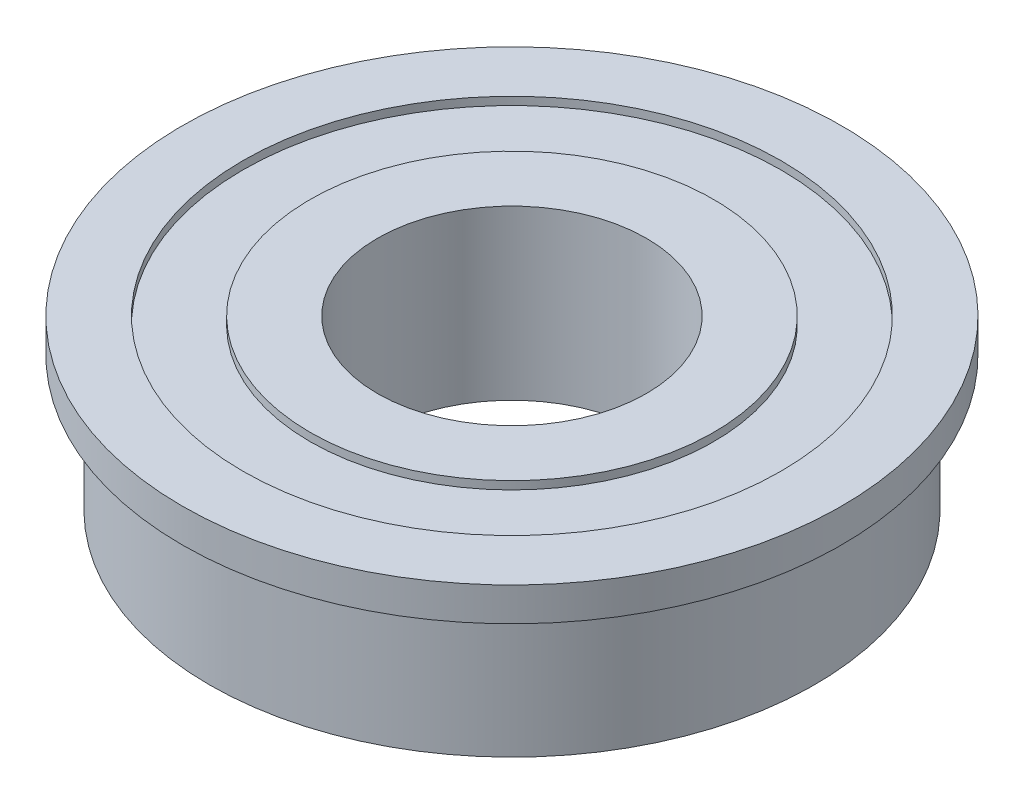
ISO-10303-21;
HEADER;
FILE_DESCRIPTION(('STEP AP214'),'2;1');
FILE_NAME('part.step','',(''),(''),'','','');
FILE_SCHEMA(('AUTOMOTIVE_DESIGN { 1 0 10303 214 1 1 1 1 }'));
ENDSEC;
DATA;
#1=APPLICATION_CONTEXT('core data for automotive mechanical design processes');
#2=APPLICATION_PROTOCOL_DEFINITION('international standard','automotive_design',2000,#1);
#3=PRODUCT_CONTEXT('',#1,'mechanical');
#4=PRODUCT('Part','Part','',(#3));
#5=PRODUCT_RELATED_PRODUCT_CATEGORY('part','',(#4));
#6=PRODUCT_DEFINITION_FORMATION('','',#4);
#7=PRODUCT_DEFINITION_CONTEXT('part definition',#1,'design');
#8=PRODUCT_DEFINITION('design','',#6,#7);
#9=PRODUCT_DEFINITION_SHAPE('','',#8);
#10=(LENGTH_UNIT() NAMED_UNIT(*) SI_UNIT(.MILLI.,.METRE.));
#11=(NAMED_UNIT(*) PLANE_ANGLE_UNIT() SI_UNIT($,.RADIAN.));
#12=(NAMED_UNIT(*) SI_UNIT($,.STERADIAN.) SOLID_ANGLE_UNIT());
#13=UNCERTAINTY_MEASURE_WITH_UNIT(LENGTH_MEASURE(1.E-05),#10,'distance_accuracy_value','');
#14=(GEOMETRIC_REPRESENTATION_CONTEXT(3) GLOBAL_UNCERTAINTY_ASSIGNED_CONTEXT((#13)) GLOBAL_UNIT_ASSIGNED_CONTEXT((#10,
#11,#12)) REPRESENTATION_CONTEXT('',''));
#15=CARTESIAN_POINT('',(0.,0.,0.));
#16=DIRECTION('',(0.,0.,1.));
#17=DIRECTION('',(1.,0.,0.));
#18=AXIS2_PLACEMENT_3D('',#15,#16,#17);
#19=CARTESIAN_POINT('',(14.2875,0.,0.));
#20=DIRECTION('',(0.,-1.,0.));
#21=DIRECTION('',(0.,0.,-1.));
#22=AXIS2_PLACEMENT_3D('',#19,#20,#21);
#23=PLANE('',#22);
#24=CARTESIAN_POINT('',(0.,0.,0.));
#25=DIRECTION('',(0.,1.,0.));
#26=DIRECTION('',(0.,0.,1.));
#27=AXIS2_PLACEMENT_3D('',#24,#25,#26);
#28=CIRCLE('',#27,6.35);
#29=CARTESIAN_POINT('',(0.,0.,6.35));
#30=VERTEX_POINT('',#29);
#31=EDGE_CURVE('E42',#30,#30,#28,.T.);
#32=ORIENTED_EDGE('',*,*,#31,.T.);
#33=EDGE_LOOP('',(#32));
#34=FACE_BOUND('',#33,.T.);
#35=CARTESIAN_POINT('',(0.,0.,0.));
#36=DIRECTION('',(0.,-1.,0.));
#37=DIRECTION('',(0.,0.,-1.));
#38=AXIS2_PLACEMENT_3D('',#35,#36,#37);
#39=CIRCLE('',#38,9.525);
#40=CARTESIAN_POINT('',(0.,0.,-9.525));
#41=VERTEX_POINT('',#40);
#42=EDGE_CURVE('E83',#41,#41,#39,.T.);
#43=ORIENTED_EDGE('',*,*,#42,.T.);
#44=EDGE_LOOP('',(#43));
#45=FACE_BOUND('',#44,.T.);
#46=ADVANCED_FACE('F34',(#34,#45),#23,.T.);
#47=CARTESIAN_POINT('',(0.,0.,0.));
#48=DIRECTION('',(0.,1.,0.));
#49=DIRECTION('',(0.,0.,1.));
#50=AXIS2_PLACEMENT_3D('',#47,#48,#49);
#51=CYLINDRICAL_SURFACE('',#50,12.7);
#52=CARTESIAN_POINT('',(0.,7.9375,0.));
#53=DIRECTION('',(0.,1.,0.));
#54=DIRECTION('',(0.,0.,1.));
#55=AXIS2_PLACEMENT_3D('',#52,#53,#54);
#56=CIRCLE('',#55,12.7);
#57=CARTESIAN_POINT('',(0.,7.9375,12.7));
#58=VERTEX_POINT('',#57);
#59=EDGE_CURVE('E69',#58,#58,#56,.F.);
#60=ORIENTED_EDGE('',*,*,#59,.F.);
#61=EDGE_LOOP('',(#60));
#62=FACE_BOUND('',#61,.T.);
#63=CARTESIAN_POINT('',(0.,7.5565,0.));
#64=DIRECTION('',(0.,1.,0.));
#65=DIRECTION('',(0.,0.,1.));
#66=AXIS2_PLACEMENT_3D('',#63,#64,#65);
#67=CIRCLE('',#66,12.7);
#68=CARTESIAN_POINT('',(0.,7.5565,12.7));
#69=VERTEX_POINT('',#68);
#70=EDGE_CURVE('E38',#69,#69,#67,.T.);
#71=ORIENTED_EDGE('',*,*,#70,.F.);
#72=EDGE_LOOP('',(#71));
#73=FACE_BOUND('',#72,.T.);
#74=ADVANCED_FACE('F36',(#62,#73),#51,.F.);
#75=CARTESIAN_POINT('',(9.525,7.5565,0.));
#76=DIRECTION('',(0.,1.,0.));
#77=DIRECTION('',(0.,0.,1.));
#78=AXIS2_PLACEMENT_3D('',#75,#76,#77);
#79=PLANE('',#78);
#80=CARTESIAN_POINT('',(0.,7.5565,0.));
#81=DIRECTION('',(0.,1.,0.));
#82=DIRECTION('',(0.,0.,1.));
#83=AXIS2_PLACEMENT_3D('',#80,#81,#82);
#84=CIRCLE('',#83,9.525);
#85=CARTESIAN_POINT('',(0.,7.5565,9.525));
#86=VERTEX_POINT('',#85);
#87=EDGE_CURVE('E67',#86,#86,#84,.T.);
#88=ORIENTED_EDGE('',*,*,#87,.F.);
#89=EDGE_LOOP('',(#88));
#90=FACE_BOUND('',#89,.T.);
#91=ORIENTED_EDGE('',*,*,#70,.T.);
#92=EDGE_LOOP('',(#91));
#93=FACE_BOUND('',#92,.T.);
#94=ADVANCED_FACE('F110',(#90,#93),#79,.T.);
#95=CARTESIAN_POINT('',(12.7,7.9375,0.));
#96=DIRECTION('',(0.,1.,0.));
#97=DIRECTION('',(0.,0.,1.));
#98=AXIS2_PLACEMENT_3D('',#95,#96,#97);
#99=PLANE('',#98);
#100=ORIENTED_EDGE('',*,*,#59,.T.);
#101=EDGE_LOOP('',(#100));
#102=FACE_BOUND('',#101,.T.);
#103=CARTESIAN_POINT('',(0.,7.9375,0.));
#104=DIRECTION('',(0.,1.,0.));
#105=DIRECTION('',(0.,0.,1.));
#106=AXIS2_PLACEMENT_3D('',#103,#104,#105);
#107=CIRCLE('',#106,15.5575);
#108=CARTESIAN_POINT('',(0.,7.9375,15.5575));
#109=VERTEX_POINT('',#108);
#110=EDGE_CURVE('E64',#109,#109,#107,.F.);
#111=ORIENTED_EDGE('',*,*,#110,.F.);
#112=EDGE_LOOP('',(#111));
#113=FACE_BOUND('',#112,.T.);
#114=ADVANCED_FACE('F146',(#102,#113),#99,.T.);
#115=CARTESIAN_POINT('',(0.,0.,0.));
#116=DIRECTION('',(0.,1.,0.));
#117=DIRECTION('',(0.,0.,1.));
#118=AXIS2_PLACEMENT_3D('',#115,#116,#117);
#119=CYLINDRICAL_SURFACE('',#118,9.525);
#120=ORIENTED_EDGE('',*,*,#87,.T.);
#121=EDGE_LOOP('',(#120));
#122=FACE_BOUND('',#121,.T.);
#123=CARTESIAN_POINT('',(0.,7.9375,0.));
#124=DIRECTION('',(0.,1.,0.));
#125=DIRECTION('',(0.,0.,1.));
#126=AXIS2_PLACEMENT_3D('',#123,#124,#125);
#127=CIRCLE('',#126,9.525);
#128=CARTESIAN_POINT('',(0.,7.9375,9.525));
#129=VERTEX_POINT('',#128);
#130=EDGE_CURVE('E61',#129,#129,#127,.T.);
#131=ORIENTED_EDGE('',*,*,#130,.F.);
#132=EDGE_LOOP('',(#131));
#133=FACE_BOUND('',#132,.T.);
#134=ADVANCED_FACE('F142',(#122,#133),#119,.T.);
#135=CARTESIAN_POINT('',(0.,0.,0.));
#136=DIRECTION('',(0.,1.,0.));
#137=DIRECTION('',(0.,0.,1.));
#138=AXIS2_PLACEMENT_3D('',#135,#136,#137);
#139=CYLINDRICAL_SURFACE('',#138,15.5575);
#140=CARTESIAN_POINT('',(0.,6.35,0.));
#141=DIRECTION('',(0.,1.,0.));
#142=DIRECTION('',(0.,0.,1.));
#143=AXIS2_PLACEMENT_3D('',#140,#141,#142);
#144=CIRCLE('',#143,15.5575);
#145=CARTESIAN_POINT('',(0.,6.35,15.5575));
#146=VERTEX_POINT('',#145);
#147=EDGE_CURVE('E58',#146,#146,#144,.F.);
#148=ORIENTED_EDGE('',*,*,#147,.F.);
#149=EDGE_LOOP('',(#148));
#150=FACE_BOUND('',#149,.T.);
#151=ORIENTED_EDGE('',*,*,#110,.T.);
#152=EDGE_LOOP('',(#151));
#153=FACE_BOUND('',#152,.T.);
#154=ADVANCED_FACE('F138',(#150,#153),#139,.T.);
#155=CARTESIAN_POINT('',(6.35,7.9375,0.));
#156=DIRECTION('',(0.,1.,0.));
#157=DIRECTION('',(0.,0.,1.));
#158=AXIS2_PLACEMENT_3D('',#155,#156,#157);
#159=PLANE('',#158);
#160=CARTESIAN_POINT('',(0.,7.9375,0.));
#161=DIRECTION('',(0.,1.,0.));
#162=DIRECTION('',(0.,0.,1.));
#163=AXIS2_PLACEMENT_3D('',#160,#161,#162);
#164=CIRCLE('',#163,6.35);
#165=CARTESIAN_POINT('',(0.,7.9375,6.35));
#166=VERTEX_POINT('',#165);
#167=EDGE_CURVE('E55',#166,#166,#164,.F.);
#168=ORIENTED_EDGE('',*,*,#167,.T.);
#169=EDGE_LOOP('',(#168));
#170=FACE_BOUND('',#169,.T.);
#171=ORIENTED_EDGE('',*,*,#130,.T.);
#172=EDGE_LOOP('',(#171));
#173=FACE_BOUND('',#172,.T.);
#174=ADVANCED_FACE('F134',(#170,#173),#159,.T.);
#175=CARTESIAN_POINT('',(15.5575,6.35,0.));
#176=DIRECTION('',(0.,-1.,0.));
#177=DIRECTION('',(0.,0.,-1.));
#178=AXIS2_PLACEMENT_3D('',#175,#176,#177);
#179=PLANE('',#178);
#180=ORIENTED_EDGE('',*,*,#147,.T.);
#181=EDGE_LOOP('',(#180));
#182=FACE_BOUND('',#181,.T.);
#183=CARTESIAN_POINT('',(0.,6.35,0.));
#184=DIRECTION('',(0.,1.,0.));
#185=DIRECTION('',(0.,0.,1.));
#186=AXIS2_PLACEMENT_3D('',#183,#184,#185);
#187=CIRCLE('',#186,14.2875);
#188=CARTESIAN_POINT('',(0.,6.35,14.2875));
#189=VERTEX_POINT('',#188);
#190=EDGE_CURVE('E47',#189,#189,#187,.F.);
#191=ORIENTED_EDGE('',*,*,#190,.F.);
#192=EDGE_LOOP('',(#191));
#193=FACE_BOUND('',#192,.T.);
#194=ADVANCED_FACE('F127',(#182,#193),#179,.T.);
#195=CARTESIAN_POINT('',(0.,0.,0.));
#196=DIRECTION('',(0.,1.,0.));
#197=DIRECTION('',(0.,0.,1.));
#198=AXIS2_PLACEMENT_3D('',#195,#196,#197);
#199=CYLINDRICAL_SURFACE('',#198,6.35);
#200=ORIENTED_EDGE('',*,*,#167,.F.);
#201=EDGE_LOOP('',(#200));
#202=FACE_BOUND('',#201,.T.);
#203=ORIENTED_EDGE('',*,*,#31,.F.);
#204=EDGE_LOOP('',(#203));
#205=FACE_BOUND('',#204,.T.);
#206=ADVANCED_FACE('F120',(#202,#205),#199,.F.);
#207=CARTESIAN_POINT('',(0.,0.,0.));
#208=DIRECTION('',(0.,1.,0.));
#209=DIRECTION('',(0.,0.,1.));
#210=AXIS2_PLACEMENT_3D('',#207,#208,#209);
#211=CYLINDRICAL_SURFACE('',#210,14.2875);
#212=CARTESIAN_POINT('',(0.,0.,0.));
#213=DIRECTION('',(0.,1.,0.));
#214=DIRECTION('',(0.,0.,1.));
#215=AXIS2_PLACEMENT_3D('',#212,#213,#214);
#216=CIRCLE('',#215,14.2875);
#217=CARTESIAN_POINT('',(0.,0.,14.2875));
#218=VERTEX_POINT('',#217);
#219=EDGE_CURVE('E10',#218,#218,#216,.F.);
#220=ORIENTED_EDGE('',*,*,#219,.F.);
#221=EDGE_LOOP('',(#220));
#222=FACE_BOUND('',#221,.T.);
#223=ORIENTED_EDGE('',*,*,#190,.T.);
#224=EDGE_LOOP('',(#223));
#225=FACE_BOUND('',#224,.T.);
#226=ADVANCED_FACE('F115',(#222,#225),#211,.T.);
#227=CARTESIAN_POINT('',(0.,0.,0.));
#228=DIRECTION('',(0.,-1.,0.));
#229=DIRECTION('',(0.,0.,-1.));
#230=AXIS2_PLACEMENT_3D('',#227,#228,#229);
#231=CIRCLE('',#230,12.7);
#232=CARTESIAN_POINT('',(0.,0.,-12.7));
#233=VERTEX_POINT('',#232);
#234=EDGE_CURVE('E50',#233,#233,#231,.T.);
#235=ORIENTED_EDGE('',*,*,#234,.F.);
#236=EDGE_LOOP('',(#235));
#237=FACE_BOUND('',#236,.T.);
#238=ORIENTED_EDGE('',*,*,#219,.T.);
#239=EDGE_LOOP('',(#238));
#240=FACE_BOUND('',#239,.T.);
#241=ADVANCED_FACE('F101',(#237,#240),#23,.T.);
#242=CARTESIAN_POINT('',(0.,1.27,0.));
#243=DIRECTION('',(0.,-1.,0.));
#244=DIRECTION('',(0.,0.,-1.));
#245=AXIS2_PLACEMENT_3D('',#242,#243,#244);
#246=CYLINDRICAL_SURFACE('',#245,12.7);
#247=CARTESIAN_POINT('',(0.,1.27,0.));
#248=DIRECTION('',(0.,-1.,0.));
#249=DIRECTION('',(0.,0.,-1.));
#250=AXIS2_PLACEMENT_3D('',#247,#248,#249);
#251=CIRCLE('',#250,12.7);
#252=CARTESIAN_POINT('',(0.,1.27,-12.7));
#253=VERTEX_POINT('',#252);
#254=EDGE_CURVE('E74',#253,#253,#251,.T.);
#255=ORIENTED_EDGE('',*,*,#254,.F.);
#256=EDGE_LOOP('',(#255));
#257=FACE_BOUND('',#256,.T.);
#258=ORIENTED_EDGE('',*,*,#234,.T.);
#259=EDGE_LOOP('',(#258));
#260=FACE_BOUND('',#259,.T.);
#261=ADVANCED_FACE('F94',(#257,#260),#246,.F.);
#262=CARTESIAN_POINT('',(0.,1.27,0.));
#263=DIRECTION('',(0.,-1.,0.));
#264=DIRECTION('',(0.,0.,-1.));
#265=AXIS2_PLACEMENT_3D('',#262,#263,#264);
#266=PLANE('',#265);
#267=CARTESIAN_POINT('',(0.,1.27,0.));
#268=DIRECTION('',(0.,-1.,0.));
#269=DIRECTION('',(0.,0.,-1.));
#270=AXIS2_PLACEMENT_3D('',#267,#268,#269);
#271=CIRCLE('',#270,9.525);
#272=CARTESIAN_POINT('',(0.,1.27,-9.525));
#273=VERTEX_POINT('',#272);
#274=EDGE_CURVE('E81',#273,#273,#271,.T.);
#275=ORIENTED_EDGE('',*,*,#274,.F.);
#276=EDGE_LOOP('',(#275));
#277=FACE_BOUND('',#276,.T.);
#278=ORIENTED_EDGE('',*,*,#254,.T.);
#279=EDGE_LOOP('',(#278));
#280=FACE_BOUND('',#279,.T.);
#281=ADVANCED_FACE('F92',(#277,#280),#266,.T.);
#282=CARTESIAN_POINT('',(0.,1.27,0.));
#283=DIRECTION('',(0.,-1.,0.));
#284=DIRECTION('',(0.,0.,-1.));
#285=AXIS2_PLACEMENT_3D('',#282,#283,#284);
#286=CYLINDRICAL_SURFACE('',#285,9.525);
#287=ORIENTED_EDGE('',*,*,#274,.T.);
#288=EDGE_LOOP('',(#287));
#289=FACE_BOUND('',#288,.T.);
#290=ORIENTED_EDGE('',*,*,#42,.F.);
#291=EDGE_LOOP('',(#290));
#292=FACE_BOUND('',#291,.T.);
#293=ADVANCED_FACE('F89',(#289,#292),#286,.T.);
#294=CLOSED_SHELL('',(#46,#74,#94,#114,#134,#154,#174,#194,#206,#226,#241,#261,#281,#293));
#295=MANIFOLD_SOLID_BREP('B2',#294);
#296=ADVANCED_BREP_SHAPE_REPRESENTATION('',(#18,#295),#14);
#297=SHAPE_DEFINITION_REPRESENTATION(#9,#296);
ENDSEC;
END-ISO-10303-21;
